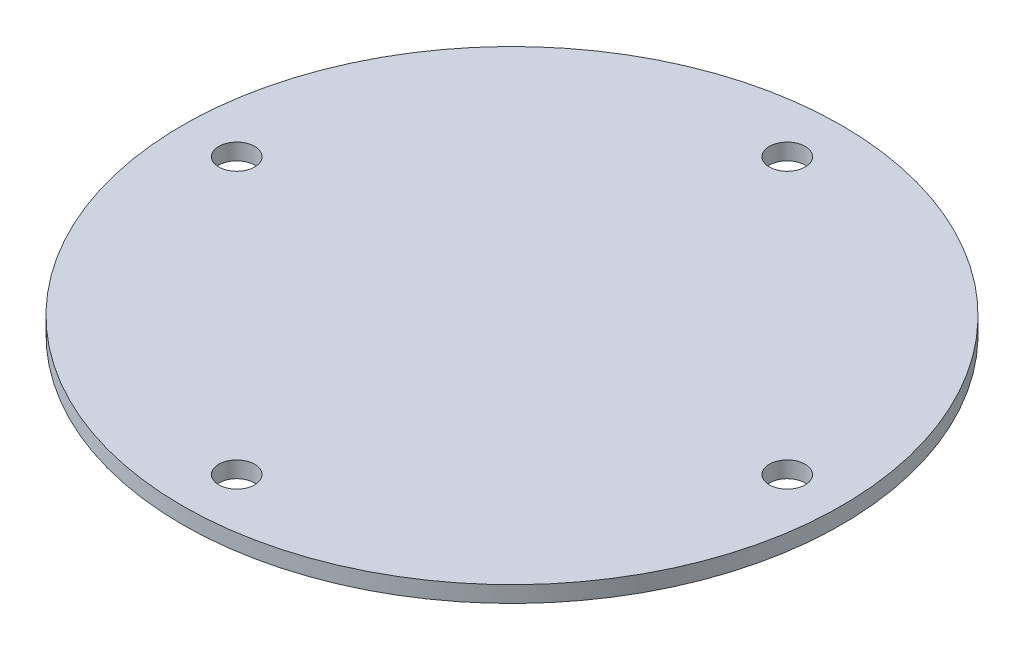
ISO-10303-21;
HEADER;
FILE_DESCRIPTION(('STEP AP214'),'2;1');
FILE_NAME('part.step','',(''),(''),'','','');
FILE_SCHEMA(('AUTOMOTIVE_DESIGN { 1 0 10303 214 1 1 1 1 }'));
ENDSEC;
DATA;
#1=APPLICATION_CONTEXT('core data for automotive mechanical design processes');
#2=APPLICATION_PROTOCOL_DEFINITION('international standard','automotive_design',2000,#1);
#3=PRODUCT_CONTEXT('',#1,'mechanical');
#4=PRODUCT('Part','Part','',(#3));
#5=PRODUCT_RELATED_PRODUCT_CATEGORY('part','',(#4));
#6=PRODUCT_DEFINITION_FORMATION('','',#4);
#7=PRODUCT_DEFINITION_CONTEXT('part definition',#1,'design');
#8=PRODUCT_DEFINITION('design','',#6,#7);
#9=PRODUCT_DEFINITION_SHAPE('','',#8);
#10=(LENGTH_UNIT() NAMED_UNIT(*) SI_UNIT(.MILLI.,.METRE.));
#11=(NAMED_UNIT(*) PLANE_ANGLE_UNIT() SI_UNIT($,.RADIAN.));
#12=(NAMED_UNIT(*) SI_UNIT($,.STERADIAN.) SOLID_ANGLE_UNIT());
#13=UNCERTAINTY_MEASURE_WITH_UNIT(LENGTH_MEASURE(1.E-05),#10,'distance_accuracy_value','');
#14=(GEOMETRIC_REPRESENTATION_CONTEXT(3) GLOBAL_UNCERTAINTY_ASSIGNED_CONTEXT((#13)) GLOBAL_UNIT_ASSIGNED_CONTEXT((#10,
#11,#12)) REPRESENTATION_CONTEXT('',''));
#15=CARTESIAN_POINT('',(0.,0.,0.));
#16=DIRECTION('',(0.,0.,1.));
#17=DIRECTION('',(1.,0.,0.));
#18=AXIS2_PLACEMENT_3D('',#15,#16,#17);
#19=CARTESIAN_POINT('',(0.,1.5,0.));
#20=DIRECTION('',(0.,-1.,0.));
#21=DIRECTION('',(0.,0.,-1.));
#22=AXIS2_PLACEMENT_3D('',#19,#20,#21);
#23=CYLINDRICAL_SURFACE('',#22,60.7);
#24=CARTESIAN_POINT('',(0.,1.5,0.));
#25=DIRECTION('',(0.,1.,0.));
#26=DIRECTION('',(0.,0.,1.));
#27=AXIS2_PLACEMENT_3D('',#24,#25,#26);
#28=CIRCLE('',#27,60.7);
#29=CARTESIAN_POINT('',(0.,1.5,60.7));
#30=VERTEX_POINT('',#29);
#31=EDGE_CURVE('E10',#30,#30,#28,.T.);
#32=ORIENTED_EDGE('',*,*,#31,.F.);
#33=EDGE_LOOP('',(#32));
#34=FACE_BOUND('',#33,.T.);
#35=CARTESIAN_POINT('',(0.,-1.5,0.));
#36=DIRECTION('',(0.,1.,0.));
#37=DIRECTION('',(0.,0.,1.));
#38=AXIS2_PLACEMENT_3D('',#35,#36,#37);
#39=CIRCLE('',#38,60.7);
#40=CARTESIAN_POINT('',(0.,-1.5,60.7));
#41=VERTEX_POINT('',#40);
#42=EDGE_CURVE('E37',#41,#41,#39,.T.);
#43=ORIENTED_EDGE('',*,*,#42,.T.);
#44=EDGE_LOOP('',(#43));
#45=FACE_BOUND('',#44,.T.);
#46=ADVANCED_FACE('F34',(#34,#45),#23,.T.);
#47=CARTESIAN_POINT('',(0.,1.5,0.));
#48=DIRECTION('',(0.,1.,0.));
#49=DIRECTION('',(0.,0.,1.));
#50=AXIS2_PLACEMENT_3D('',#47,#48,#49);
#51=PLANE('',#50);
#52=CARTESIAN_POINT('',(-1.77018103879347E-13,1.5,-50.7));
#53=DIRECTION('',(0.,1.,0.));
#54=DIRECTION('',(1.,0.,0.));
#55=AXIS2_PLACEMENT_3D('',#52,#53,#54);
#56=CIRCLE('',#55,3.3);
#57=CARTESIAN_POINT('',(3.29999999999982,1.5,-50.7));
#58=VERTEX_POINT('',#57);
#59=EDGE_CURVE('E51',#58,#58,#56,.T.);
#60=ORIENTED_EDGE('',*,*,#59,.F.);
#61=EDGE_LOOP('',(#60));
#62=FACE_BOUND('',#61,.T.);
#63=CARTESIAN_POINT('',(-50.7,1.5,0.));
#64=DIRECTION('',(0.,1.,0.));
#65=DIRECTION('',(0.,0.,-1.));
#66=AXIS2_PLACEMENT_3D('',#63,#64,#65);
#67=CIRCLE('',#66,3.3);
#68=CARTESIAN_POINT('',(-50.7,1.5,-3.3));
#69=VERTEX_POINT('',#68);
#70=EDGE_CURVE('E59',#69,#69,#67,.T.);
#71=ORIENTED_EDGE('',*,*,#70,.F.);
#72=EDGE_LOOP('',(#71));
#73=FACE_BOUND('',#72,.T.);
#74=CARTESIAN_POINT('',(5.31054311638041E-13,1.5,50.7));
#75=DIRECTION('',(0.,1.,0.));
#76=DIRECTION('',(-1.,0.,0.));
#77=AXIS2_PLACEMENT_3D('',#74,#75,#76);
#78=CIRCLE('',#77,3.3);
#79=CARTESIAN_POINT('',(-3.29999999999947,1.5,50.7));
#80=VERTEX_POINT('',#79);
#81=EDGE_CURVE('E52',#80,#80,#78,.T.);
#82=ORIENTED_EDGE('',*,*,#81,.F.);
#83=EDGE_LOOP('',(#82));
#84=FACE_BOUND('',#83,.T.);
#85=CARTESIAN_POINT('',(50.7,1.5,0.));
#86=DIRECTION('',(0.,1.,0.));
#87=DIRECTION('',(0.,0.,1.));
#88=AXIS2_PLACEMENT_3D('',#85,#86,#87);
#89=CIRCLE('',#88,3.3);
#90=CARTESIAN_POINT('',(50.7,1.5,3.3));
#91=VERTEX_POINT('',#90);
#92=EDGE_CURVE('E48',#91,#91,#89,.T.);
#93=ORIENTED_EDGE('',*,*,#92,.F.);
#94=EDGE_LOOP('',(#93));
#95=FACE_BOUND('',#94,.T.);
#96=ORIENTED_EDGE('',*,*,#31,.T.);
#97=EDGE_LOOP('',(#96));
#98=FACE_BOUND('',#97,.T.);
#99=ADVANCED_FACE('F80',(#62,#73,#84,#95,#98),#51,.T.);
#100=CARTESIAN_POINT('',(0.,-1.5,0.));
#101=DIRECTION('',(0.,1.,0.));
#102=DIRECTION('',(0.,0.,1.));
#103=AXIS2_PLACEMENT_3D('',#100,#101,#102);
#104=PLANE('',#103);
#105=CARTESIAN_POINT('',(-1.77018103879347E-13,-1.5,-50.7));
#106=DIRECTION('',(0.,1.,0.));
#107=DIRECTION('',(1.,0.,0.));
#108=AXIS2_PLACEMENT_3D('',#105,#106,#107);
#109=CIRCLE('',#108,3.3);
#110=CARTESIAN_POINT('',(3.29999999999982,-1.5,-50.7));
#111=VERTEX_POINT('',#110);
#112=EDGE_CURVE('E62',#111,#111,#109,.T.);
#113=ORIENTED_EDGE('',*,*,#112,.T.);
#114=EDGE_LOOP('',(#113));
#115=FACE_BOUND('',#114,.T.);
#116=CARTESIAN_POINT('',(-50.7,-1.5,0.));
#117=DIRECTION('',(0.,1.,0.));
#118=DIRECTION('',(0.,0.,-1.));
#119=AXIS2_PLACEMENT_3D('',#116,#117,#118);
#120=CIRCLE('',#119,3.3);
#121=CARTESIAN_POINT('',(-50.7,-1.5,-3.3));
#122=VERTEX_POINT('',#121);
#123=EDGE_CURVE('E55',#122,#122,#120,.T.);
#124=ORIENTED_EDGE('',*,*,#123,.T.);
#125=EDGE_LOOP('',(#124));
#126=FACE_BOUND('',#125,.T.);
#127=CARTESIAN_POINT('',(5.31054311638041E-13,-1.5,50.7));
#128=DIRECTION('',(0.,1.,0.));
#129=DIRECTION('',(-1.,0.,0.));
#130=AXIS2_PLACEMENT_3D('',#127,#128,#129);
#131=CIRCLE('',#130,3.3);
#132=CARTESIAN_POINT('',(-3.29999999999947,-1.5,50.7));
#133=VERTEX_POINT('',#132);
#134=EDGE_CURVE('E56',#133,#133,#131,.T.);
#135=ORIENTED_EDGE('',*,*,#134,.T.);
#136=EDGE_LOOP('',(#135));
#137=FACE_BOUND('',#136,.T.);
#138=CARTESIAN_POINT('',(50.7,-1.5,0.));
#139=DIRECTION('',(0.,1.,0.));
#140=DIRECTION('',(0.,0.,1.));
#141=AXIS2_PLACEMENT_3D('',#138,#139,#140);
#142=CIRCLE('',#141,3.3);
#143=CARTESIAN_POINT('',(50.7,-1.5,3.3));
#144=VERTEX_POINT('',#143);
#145=EDGE_CURVE('E44',#144,#144,#142,.T.);
#146=ORIENTED_EDGE('',*,*,#145,.T.);
#147=EDGE_LOOP('',(#146));
#148=FACE_BOUND('',#147,.T.);
#149=ORIENTED_EDGE('',*,*,#42,.F.);
#150=EDGE_LOOP('',(#149));
#151=FACE_BOUND('',#150,.T.);
#152=ADVANCED_FACE('F70',(#115,#126,#137,#148,#151),#104,.F.);
#153=CARTESIAN_POINT('',(50.7,1.5,0.));
#154=DIRECTION('',(0.,1.,0.));
#155=DIRECTION('',(0.,0.,1.));
#156=AXIS2_PLACEMENT_3D('',#153,#154,#155);
#157=CYLINDRICAL_SURFACE('',#156,3.3);
#158=ORIENTED_EDGE('',*,*,#145,.F.);
#159=EDGE_LOOP('',(#158));
#160=FACE_BOUND('',#159,.T.);
#161=ORIENTED_EDGE('',*,*,#92,.T.);
#162=EDGE_LOOP('',(#161));
#163=FACE_BOUND('',#162,.T.);
#164=ADVANCED_FACE('F90',(#160,#163),#157,.F.);
#165=CARTESIAN_POINT('',(5.31054311638041E-13,1.5,50.7));
#166=DIRECTION('',(0.,1.,0.));
#167=DIRECTION('',(-1.,0.,0.));
#168=AXIS2_PLACEMENT_3D('',#165,#166,#167);
#169=CYLINDRICAL_SURFACE('',#168,3.3);
#170=ORIENTED_EDGE('',*,*,#134,.F.);
#171=EDGE_LOOP('',(#170));
#172=FACE_BOUND('',#171,.T.);
#173=ORIENTED_EDGE('',*,*,#81,.T.);
#174=EDGE_LOOP('',(#173));
#175=FACE_BOUND('',#174,.T.);
#176=ADVANCED_FACE('F92',(#172,#175),#169,.F.);
#177=CARTESIAN_POINT('',(-50.7,1.5,0.));
#178=DIRECTION('',(0.,1.,0.));
#179=DIRECTION('',(0.,0.,-1.));
#180=AXIS2_PLACEMENT_3D('',#177,#178,#179);
#181=CYLINDRICAL_SURFACE('',#180,3.3);
#182=ORIENTED_EDGE('',*,*,#123,.F.);
#183=EDGE_LOOP('',(#182));
#184=FACE_BOUND('',#183,.T.);
#185=ORIENTED_EDGE('',*,*,#70,.T.);
#186=EDGE_LOOP('',(#185));
#187=FACE_BOUND('',#186,.T.);
#188=ADVANCED_FACE('F76',(#184,#187),#181,.F.);
#189=CARTESIAN_POINT('',(-1.77018103879347E-13,1.5,-50.7));
#190=DIRECTION('',(0.,1.,0.));
#191=DIRECTION('',(1.,0.,0.));
#192=AXIS2_PLACEMENT_3D('',#189,#190,#191);
#193=CYLINDRICAL_SURFACE('',#192,3.3);
#194=ORIENTED_EDGE('',*,*,#112,.F.);
#195=EDGE_LOOP('',(#194));
#196=FACE_BOUND('',#195,.T.);
#197=ORIENTED_EDGE('',*,*,#59,.T.);
#198=EDGE_LOOP('',(#197));
#199=FACE_BOUND('',#198,.T.);
#200=ADVANCED_FACE('F73',(#196,#199),#193,.F.);
#201=CLOSED_SHELL('',(#46,#99,#152,#164,#176,#188,#200));
#202=MANIFOLD_SOLID_BREP('B2',#201);
#203=ADVANCED_BREP_SHAPE_REPRESENTATION('',(#18,#202),#14);
#204=SHAPE_DEFINITION_REPRESENTATION(#9,#203);
ENDSEC;
END-ISO-10303-21;
